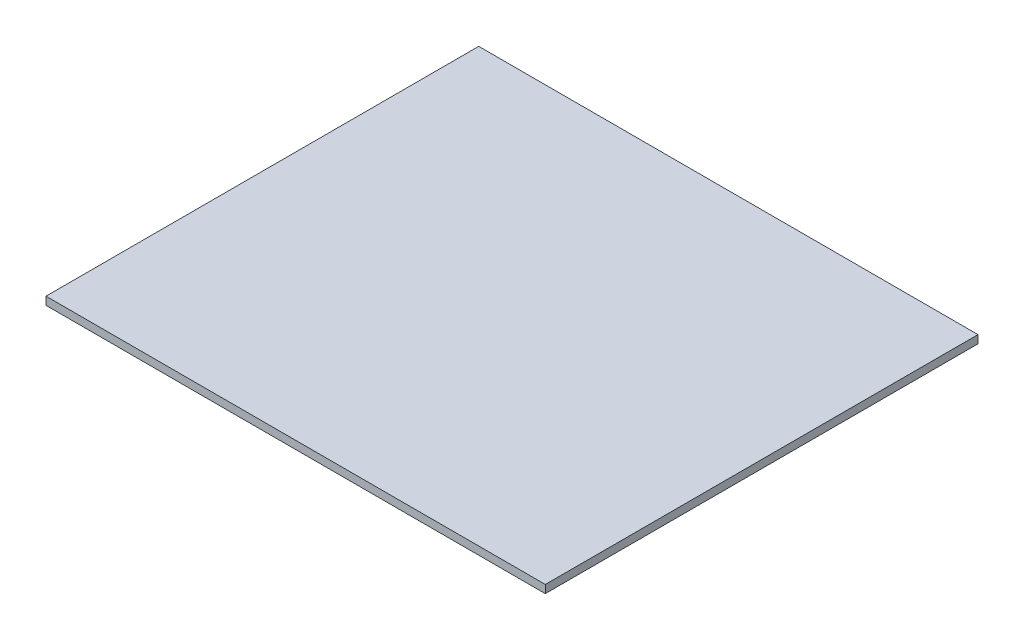
ISO-10303-21;
HEADER;
FILE_DESCRIPTION(('STEP AP214'),'2;1');
FILE_NAME('part.step','',(''),(''),'','','');
FILE_SCHEMA(('AUTOMOTIVE_DESIGN { 1 0 10303 214 1 1 1 1 }'));
ENDSEC;
DATA;
#1=APPLICATION_CONTEXT('core data for automotive mechanical design processes');
#2=APPLICATION_PROTOCOL_DEFINITION('international standard','automotive_design',2000,#1);
#3=PRODUCT_CONTEXT('',#1,'mechanical');
#4=PRODUCT('Part','Part','',(#3));
#5=PRODUCT_RELATED_PRODUCT_CATEGORY('part','',(#4));
#6=PRODUCT_DEFINITION_FORMATION('','',#4);
#7=PRODUCT_DEFINITION_CONTEXT('part definition',#1,'design');
#8=PRODUCT_DEFINITION('design','',#6,#7);
#9=PRODUCT_DEFINITION_SHAPE('','',#8);
#10=(LENGTH_UNIT() NAMED_UNIT(*) SI_UNIT(.MILLI.,.METRE.));
#11=(NAMED_UNIT(*) PLANE_ANGLE_UNIT() SI_UNIT($,.RADIAN.));
#12=(NAMED_UNIT(*) SI_UNIT($,.STERADIAN.) SOLID_ANGLE_UNIT());
#13=UNCERTAINTY_MEASURE_WITH_UNIT(LENGTH_MEASURE(1.E-05),#10,'distance_accuracy_value','');
#14=(GEOMETRIC_REPRESENTATION_CONTEXT(3) GLOBAL_UNCERTAINTY_ASSIGNED_CONTEXT((#13)) GLOBAL_UNIT_ASSIGNED_CONTEXT((#10,
#11,#12)) REPRESENTATION_CONTEXT('',''));
#15=CARTESIAN_POINT('',(0.,0.,0.));
#16=DIRECTION('',(0.,0.,1.));
#17=DIRECTION('',(1.,0.,0.));
#18=AXIS2_PLACEMENT_3D('',#15,#16,#17);
#19=CARTESIAN_POINT('',(37.5,1.2,32.5));
#20=DIRECTION('',(-1.,0.,0.));
#21=DIRECTION('',(0.,0.,1.));
#22=AXIS2_PLACEMENT_3D('',#19,#20,#21);
#23=PLANE('',#22);
#24=DIRECTION('',(0.,0.,-1.));
#25=VECTOR('',#24,1.);
#26=CARTESIAN_POINT('',(37.5,0.,32.5));
#27=LINE('',#26,#25);
#28=CARTESIAN_POINT('',(37.5,0.,32.5));
#29=VERTEX_POINT('',#28);
#30=CARTESIAN_POINT('',(37.5,0.,-32.5));
#31=VERTEX_POINT('',#30);
#32=EDGE_CURVE('E105',#29,#31,#27,.T.);
#33=ORIENTED_EDGE('',*,*,#32,.T.);
#34=DIRECTION('',(0.,-1.,0.));
#35=VECTOR('',#34,1.);
#36=CARTESIAN_POINT('',(37.5,1.2,-32.5));
#37=LINE('',#36,#35);
#38=CARTESIAN_POINT('',(37.5,1.2,-32.5));
#39=VERTEX_POINT('',#38);
#40=EDGE_CURVE('E11',#39,#31,#37,.T.);
#41=ORIENTED_EDGE('',*,*,#40,.F.);
#42=DIRECTION('',(0.,0.,-1.));
#43=VECTOR('',#42,1.);
#44=CARTESIAN_POINT('',(37.5,1.2,32.5));
#45=LINE('',#44,#43);
#46=CARTESIAN_POINT('',(37.5,1.2,32.5));
#47=VERTEX_POINT('',#46);
#48=EDGE_CURVE('E89',#47,#39,#45,.T.);
#49=ORIENTED_EDGE('',*,*,#48,.F.);
#50=DIRECTION('',(0.,-1.,0.));
#51=VECTOR('',#50,1.);
#52=CARTESIAN_POINT('',(37.5,1.2,32.5));
#53=LINE('',#52,#51);
#54=EDGE_CURVE('E97',#47,#29,#53,.T.);
#55=ORIENTED_EDGE('',*,*,#54,.T.);
#56=EDGE_LOOP('',(#33,#41,#49,#55));
#57=FACE_BOUND('',#56,.T.);
#58=ADVANCED_FACE('F39',(#57),#23,.F.);
#59=CARTESIAN_POINT('',(-37.5,1.2,-32.5));
#60=DIRECTION('',(0.,0.,1.));
#61=DIRECTION('',(1.,0.,0.));
#62=AXIS2_PLACEMENT_3D('',#59,#60,#61);
#63=PLANE('',#62);
#64=DIRECTION('',(-1.,0.,0.));
#65=VECTOR('',#64,1.);
#66=CARTESIAN_POINT('',(-37.5,0.,-32.5));
#67=LINE('',#66,#65);
#68=CARTESIAN_POINT('',(-37.5,0.,-32.5));
#69=VERTEX_POINT('',#68);
#70=EDGE_CURVE('E92',#31,#69,#67,.T.);
#71=ORIENTED_EDGE('',*,*,#70,.T.);
#72=DIRECTION('',(0.,-1.,0.));
#73=VECTOR('',#72,1.);
#74=CARTESIAN_POINT('',(-37.5,1.2,-32.5));
#75=LINE('',#74,#73);
#76=CARTESIAN_POINT('',(-37.5,1.2,-32.5));
#77=VERTEX_POINT('',#76);
#78=EDGE_CURVE('E50',#77,#69,#75,.T.);
#79=ORIENTED_EDGE('',*,*,#78,.F.);
#80=DIRECTION('',(-1.,0.,0.));
#81=VECTOR('',#80,1.);
#82=CARTESIAN_POINT('',(-37.5,1.2,-32.5));
#83=LINE('',#82,#81);
#84=EDGE_CURVE('E82',#39,#77,#83,.T.);
#85=ORIENTED_EDGE('',*,*,#84,.F.);
#86=ORIENTED_EDGE('',*,*,#40,.T.);
#87=EDGE_LOOP('',(#71,#79,#85,#86));
#88=FACE_BOUND('',#87,.T.);
#89=ADVANCED_FACE('F93',(#88),#63,.F.);
#90=CARTESIAN_POINT('',(-37.5,1.2,32.5));
#91=DIRECTION('',(1.,0.,0.));
#92=DIRECTION('',(0.,0.,-1.));
#93=AXIS2_PLACEMENT_3D('',#90,#91,#92);
#94=PLANE('',#93);
#95=DIRECTION('',(0.,0.,1.));
#96=VECTOR('',#95,1.);
#97=CARTESIAN_POINT('',(-37.5,0.,32.5));
#98=LINE('',#97,#96);
#99=CARTESIAN_POINT('',(-37.5,0.,32.5));
#100=VERTEX_POINT('',#99);
#101=EDGE_CURVE('E72',#69,#100,#98,.T.);
#102=ORIENTED_EDGE('',*,*,#101,.T.);
#103=DIRECTION('',(0.,-1.,0.));
#104=VECTOR('',#103,1.);
#105=CARTESIAN_POINT('',(-37.5,1.2,32.5));
#106=LINE('',#105,#104);
#107=CARTESIAN_POINT('',(-37.5,1.2,32.5));
#108=VERTEX_POINT('',#107);
#109=EDGE_CURVE('E94',#108,#100,#106,.T.);
#110=ORIENTED_EDGE('',*,*,#109,.F.);
#111=DIRECTION('',(0.,0.,1.));
#112=VECTOR('',#111,1.);
#113=CARTESIAN_POINT('',(-37.5,1.2,32.5));
#114=LINE('',#113,#112);
#115=EDGE_CURVE('E88',#77,#108,#114,.T.);
#116=ORIENTED_EDGE('',*,*,#115,.F.);
#117=ORIENTED_EDGE('',*,*,#78,.T.);
#118=EDGE_LOOP('',(#102,#110,#116,#117));
#119=FACE_BOUND('',#118,.T.);
#120=ADVANCED_FACE('F96',(#119),#94,.F.);
#121=CARTESIAN_POINT('',(-37.5,1.2,32.5));
#122=DIRECTION('',(0.,0.,-1.));
#123=DIRECTION('',(-1.,0.,0.));
#124=AXIS2_PLACEMENT_3D('',#121,#122,#123);
#125=PLANE('',#124);
#126=DIRECTION('',(1.,0.,0.));
#127=VECTOR('',#126,1.);
#128=CARTESIAN_POINT('',(-37.5,0.,32.5));
#129=LINE('',#128,#127);
#130=EDGE_CURVE('E76',#100,#29,#129,.T.);
#131=ORIENTED_EDGE('',*,*,#130,.T.);
#132=ORIENTED_EDGE('',*,*,#54,.F.);
#133=DIRECTION('',(1.,0.,0.));
#134=VECTOR('',#133,1.);
#135=CARTESIAN_POINT('',(-37.5,1.2,32.5));
#136=LINE('',#135,#134);
#137=EDGE_CURVE('E54',#108,#47,#136,.T.);
#138=ORIENTED_EDGE('',*,*,#137,.F.);
#139=ORIENTED_EDGE('',*,*,#109,.T.);
#140=EDGE_LOOP('',(#131,#132,#138,#139));
#141=FACE_BOUND('',#140,.T.);
#142=ADVANCED_FACE('F108',(#141),#125,.F.);
#143=CARTESIAN_POINT('',(0.,1.2,0.));
#144=DIRECTION('',(0.,-1.,0.));
#145=DIRECTION('',(0.,0.,-1.));
#146=AXIS2_PLACEMENT_3D('',#143,#144,#145);
#147=PLANE('',#146);
#148=ORIENTED_EDGE('',*,*,#48,.T.);
#149=ORIENTED_EDGE('',*,*,#84,.T.);
#150=ORIENTED_EDGE('',*,*,#115,.T.);
#151=ORIENTED_EDGE('',*,*,#137,.T.);
#152=EDGE_LOOP('',(#148,#149,#150,#151));
#153=FACE_BOUND('',#152,.T.);
#154=ADVANCED_FACE('F86',(#153),#147,.F.);
#155=CARTESIAN_POINT('',(0.,0.,0.));
#156=DIRECTION('',(0.,-1.,0.));
#157=DIRECTION('',(0.,0.,-1.));
#158=AXIS2_PLACEMENT_3D('',#155,#156,#157);
#159=PLANE('',#158);
#160=ORIENTED_EDGE('',*,*,#32,.F.);
#161=ORIENTED_EDGE('',*,*,#130,.F.);
#162=ORIENTED_EDGE('',*,*,#101,.F.);
#163=ORIENTED_EDGE('',*,*,#70,.F.);
#164=EDGE_LOOP('',(#160,#161,#162,#163));
#165=FACE_BOUND('',#164,.T.);
#166=ADVANCED_FACE('F115',(#165),#159,.T.);
#167=CLOSED_SHELL('',(#58,#89,#120,#142,#154,#166));
#168=MANIFOLD_SOLID_BREP('B2',#167);
#169=ADVANCED_BREP_SHAPE_REPRESENTATION('',(#18,#168),#14);
#170=SHAPE_DEFINITION_REPRESENTATION(#9,#169);
ENDSEC;
END-ISO-10303-21;
